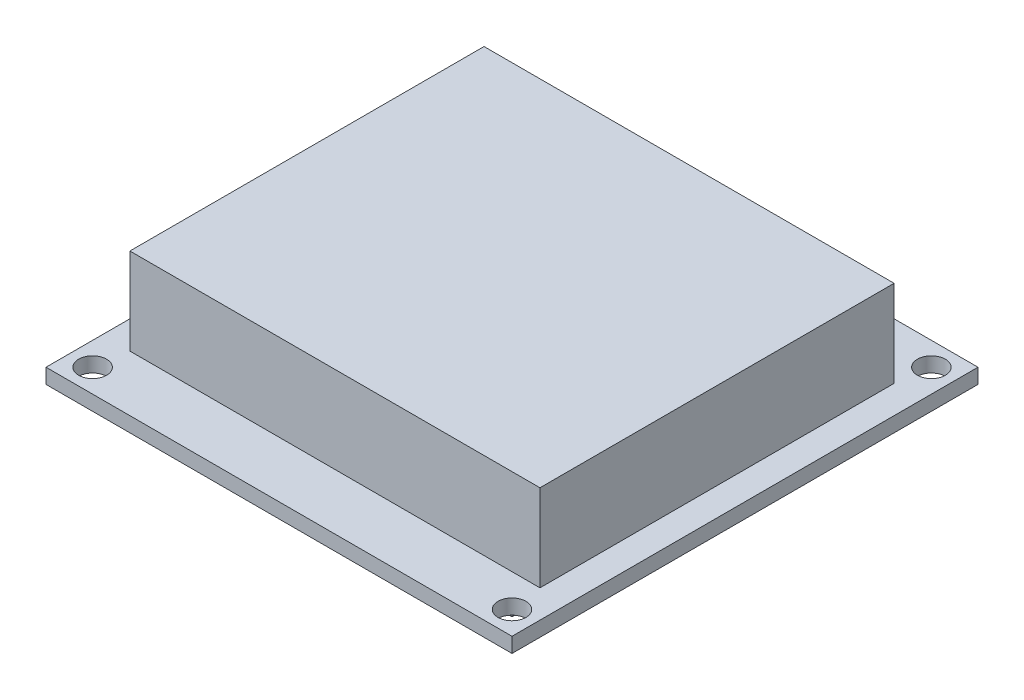
ISO-10303-21;
HEADER;
FILE_DESCRIPTION(('STEP AP214'),'2;1');
FILE_NAME('part.step','',(''),(''),'','','');
FILE_SCHEMA(('AUTOMOTIVE_DESIGN { 1 0 10303 214 1 1 1 1 }'));
ENDSEC;
DATA;
#1=APPLICATION_CONTEXT('core data for automotive mechanical design processes');
#2=APPLICATION_PROTOCOL_DEFINITION('international standard','automotive_design',2000,#1);
#3=PRODUCT_CONTEXT('',#1,'mechanical');
#4=PRODUCT('Part','Part','',(#3));
#5=PRODUCT_RELATED_PRODUCT_CATEGORY('part','',(#4));
#6=PRODUCT_DEFINITION_FORMATION('','',#4);
#7=PRODUCT_DEFINITION_CONTEXT('part definition',#1,'design');
#8=PRODUCT_DEFINITION('design','',#6,#7);
#9=PRODUCT_DEFINITION_SHAPE('','',#8);
#10=(LENGTH_UNIT() NAMED_UNIT(*) SI_UNIT(.MILLI.,.METRE.));
#11=(NAMED_UNIT(*) PLANE_ANGLE_UNIT() SI_UNIT($,.RADIAN.));
#12=(NAMED_UNIT(*) SI_UNIT($,.STERADIAN.) SOLID_ANGLE_UNIT());
#13=UNCERTAINTY_MEASURE_WITH_UNIT(LENGTH_MEASURE(1.E-05),#10,'distance_accuracy_value','');
#14=(GEOMETRIC_REPRESENTATION_CONTEXT(3) GLOBAL_UNCERTAINTY_ASSIGNED_CONTEXT((#13)) GLOBAL_UNIT_ASSIGNED_CONTEXT((#10,
#11,#12)) REPRESENTATION_CONTEXT('',''));
#15=CARTESIAN_POINT('',(0.,0.,0.));
#16=DIRECTION('',(0.,0.,1.));
#17=DIRECTION('',(1.,0.,0.));
#18=AXIS2_PLACEMENT_3D('',#15,#16,#17);
#19=CARTESIAN_POINT('',(-25.,1.6,-25.));
#20=DIRECTION('',(1.,0.,0.));
#21=DIRECTION('',(0.,0.,-1.));
#22=AXIS2_PLACEMENT_3D('',#19,#20,#21);
#23=PLANE('',#22);
#24=DIRECTION('',(0.,0.,1.));
#25=VECTOR('',#24,1.);
#26=CARTESIAN_POINT('',(-25.,0.,-25.));
#27=LINE('',#26,#25);
#28=CARTESIAN_POINT('',(-25.,0.,-25.));
#29=VERTEX_POINT('',#28);
#30=CARTESIAN_POINT('',(-25.,0.,25.));
#31=VERTEX_POINT('',#30);
#32=EDGE_CURVE('E220',#29,#31,#27,.T.);
#33=ORIENTED_EDGE('',*,*,#32,.T.);
#34=DIRECTION('',(0.,-1.,0.));
#35=VECTOR('',#34,1.);
#36=CARTESIAN_POINT('',(-25.,1.6,25.));
#37=LINE('',#36,#35);
#38=CARTESIAN_POINT('',(-25.,1.6,25.));
#39=VERTEX_POINT('',#38);
#40=EDGE_CURVE('E11',#39,#31,#37,.T.);
#41=ORIENTED_EDGE('',*,*,#40,.F.);
#42=DIRECTION('',(0.,0.,1.));
#43=VECTOR('',#42,1.);
#44=CARTESIAN_POINT('',(-25.,1.6,-25.));
#45=LINE('',#44,#43);
#46=CARTESIAN_POINT('',(-25.,1.6,-25.));
#47=VERTEX_POINT('',#46);
#48=EDGE_CURVE('E218',#47,#39,#45,.T.);
#49=ORIENTED_EDGE('',*,*,#48,.F.);
#50=DIRECTION('',(0.,-1.,0.));
#51=VECTOR('',#50,1.);
#52=CARTESIAN_POINT('',(-25.,1.6,-25.));
#53=LINE('',#52,#51);
#54=EDGE_CURVE('E229',#47,#29,#53,.T.);
#55=ORIENTED_EDGE('',*,*,#54,.T.);
#56=EDGE_LOOP('',(#33,#41,#49,#55));
#57=FACE_BOUND('',#56,.T.);
#58=ADVANCED_FACE('F39',(#57),#23,.F.);
#59=CARTESIAN_POINT('',(-25.,1.6,25.));
#60=DIRECTION('',(0.,0.,-1.));
#61=DIRECTION('',(-1.,0.,0.));
#62=AXIS2_PLACEMENT_3D('',#59,#60,#61);
#63=PLANE('',#62);
#64=DIRECTION('',(1.,0.,0.));
#65=VECTOR('',#64,1.);
#66=CARTESIAN_POINT('',(-25.,0.,25.));
#67=LINE('',#66,#65);
#68=CARTESIAN_POINT('',(25.,0.,25.));
#69=VERTEX_POINT('',#68);
#70=EDGE_CURVE('E231',#31,#69,#67,.T.);
#71=ORIENTED_EDGE('',*,*,#70,.T.);
#72=DIRECTION('',(0.,-1.,0.));
#73=VECTOR('',#72,1.);
#74=CARTESIAN_POINT('',(25.,1.6,25.));
#75=LINE('',#74,#73);
#76=CARTESIAN_POINT('',(25.,1.6,25.));
#77=VERTEX_POINT('',#76);
#78=EDGE_CURVE('E46',#77,#69,#75,.T.);
#79=ORIENTED_EDGE('',*,*,#78,.F.);
#80=DIRECTION('',(1.,0.,0.));
#81=VECTOR('',#80,1.);
#82=CARTESIAN_POINT('',(-25.,1.6,25.));
#83=LINE('',#82,#81);
#84=EDGE_CURVE('E222',#39,#77,#83,.T.);
#85=ORIENTED_EDGE('',*,*,#84,.F.);
#86=ORIENTED_EDGE('',*,*,#40,.T.);
#87=EDGE_LOOP('',(#71,#79,#85,#86));
#88=FACE_BOUND('',#87,.T.);
#89=ADVANCED_FACE('F264',(#88),#63,.F.);
#90=CARTESIAN_POINT('',(25.,1.6,-25.));
#91=DIRECTION('',(-1.,0.,0.));
#92=DIRECTION('',(0.,0.,1.));
#93=AXIS2_PLACEMENT_3D('',#90,#91,#92);
#94=PLANE('',#93);
#95=DIRECTION('',(0.,0.,-1.));
#96=VECTOR('',#95,1.);
#97=CARTESIAN_POINT('',(25.,0.,-25.));
#98=LINE('',#97,#96);
#99=CARTESIAN_POINT('',(25.,0.,-25.));
#100=VERTEX_POINT('',#99);
#101=EDGE_CURVE('E232',#69,#100,#98,.T.);
#102=ORIENTED_EDGE('',*,*,#101,.T.);
#103=DIRECTION('',(0.,-1.,0.));
#104=VECTOR('',#103,1.);
#105=CARTESIAN_POINT('',(25.,1.6,-25.));
#106=LINE('',#105,#104);
#107=CARTESIAN_POINT('',(25.,1.6,-25.));
#108=VERTEX_POINT('',#107);
#109=EDGE_CURVE('E239',#108,#100,#106,.T.);
#110=ORIENTED_EDGE('',*,*,#109,.F.);
#111=DIRECTION('',(0.,0.,-1.));
#112=VECTOR('',#111,1.);
#113=CARTESIAN_POINT('',(25.,1.6,-25.));
#114=LINE('',#113,#112);
#115=EDGE_CURVE('E228',#77,#108,#114,.T.);
#116=ORIENTED_EDGE('',*,*,#115,.F.);
#117=ORIENTED_EDGE('',*,*,#78,.T.);
#118=EDGE_LOOP('',(#102,#110,#116,#117));
#119=FACE_BOUND('',#118,.T.);
#120=ADVANCED_FACE('F250',(#119),#94,.F.);
#121=CARTESIAN_POINT('',(-25.,1.6,-25.));
#122=DIRECTION('',(0.,0.,1.));
#123=DIRECTION('',(1.,0.,0.));
#124=AXIS2_PLACEMENT_3D('',#121,#122,#123);
#125=PLANE('',#124);
#126=DIRECTION('',(-1.,0.,0.));
#127=VECTOR('',#126,1.);
#128=CARTESIAN_POINT('',(-25.,0.,-25.));
#129=LINE('',#128,#127);
#130=EDGE_CURVE('E223',#100,#29,#129,.T.);
#131=ORIENTED_EDGE('',*,*,#130,.T.);
#132=ORIENTED_EDGE('',*,*,#54,.F.);
#133=DIRECTION('',(-1.,0.,0.));
#134=VECTOR('',#133,1.);
#135=CARTESIAN_POINT('',(-25.,1.6,-25.));
#136=LINE('',#135,#134);
#137=EDGE_CURVE('E226',#108,#47,#136,.T.);
#138=ORIENTED_EDGE('',*,*,#137,.F.);
#139=ORIENTED_EDGE('',*,*,#109,.T.);
#140=EDGE_LOOP('',(#131,#132,#138,#139));
#141=FACE_BOUND('',#140,.T.);
#142=ADVANCED_FACE('F257',(#141),#125,.F.);
#143=CARTESIAN_POINT('',(0.,1.6,0.));
#144=DIRECTION('',(0.,1.,0.));
#145=DIRECTION('',(0.,0.,1.));
#146=AXIS2_PLACEMENT_3D('',#143,#144,#145);
#147=PLANE('',#146);
#148=DIRECTION('',(0.,0.,1.));
#149=VECTOR('',#148,1.);
#150=CARTESIAN_POINT('',(-22.,1.6,-19.));
#151=LINE('',#150,#149);
#152=CARTESIAN_POINT('',(-22.,1.6,-19.));
#153=VERTEX_POINT('',#152);
#154=CARTESIAN_POINT('',(-22.,1.6,19.));
#155=VERTEX_POINT('',#154);
#156=EDGE_CURVE('E62',#153,#155,#151,.T.);
#157=ORIENTED_EDGE('',*,*,#156,.F.);
#158=DIRECTION('',(-1.,0.,0.));
#159=VECTOR('',#158,1.);
#160=CARTESIAN_POINT('',(-22.,1.6,-19.));
#161=LINE('',#160,#159);
#162=CARTESIAN_POINT('',(22.,1.6,-19.));
#163=VERTEX_POINT('',#162);
#164=EDGE_CURVE('E169',#163,#153,#161,.T.);
#165=ORIENTED_EDGE('',*,*,#164,.F.);
#166=DIRECTION('',(0.,0.,-1.));
#167=VECTOR('',#166,1.);
#168=CARTESIAN_POINT('',(22.,1.6,-19.));
#169=LINE('',#168,#167);
#170=CARTESIAN_POINT('',(22.,1.6,19.));
#171=VERTEX_POINT('',#170);
#172=EDGE_CURVE('E179',#171,#163,#169,.T.);
#173=ORIENTED_EDGE('',*,*,#172,.F.);
#174=DIRECTION('',(1.,0.,0.));
#175=VECTOR('',#174,1.);
#176=CARTESIAN_POINT('',(-22.,1.6,19.));
#177=LINE('',#176,#175);
#178=EDGE_CURVE('E180',#155,#171,#177,.T.);
#179=ORIENTED_EDGE('',*,*,#178,.F.);
#180=EDGE_LOOP('',(#157,#165,#173,#179));
#181=FACE_BOUND('',#180,.T.);
#182=CARTESIAN_POINT('',(-22.5,1.6,22.5));
#183=DIRECTION('',(0.,1.,0.));
#184=DIRECTION('',(0.,0.,1.));
#185=AXIS2_PLACEMENT_3D('',#182,#183,#184);
#186=CIRCLE('',#185,1.5);
#187=CARTESIAN_POINT('',(-22.5,1.6,24.));
#188=VERTEX_POINT('',#187);
#189=EDGE_CURVE('E207',#188,#188,#186,.T.);
#190=ORIENTED_EDGE('',*,*,#189,.F.);
#191=EDGE_LOOP('',(#190));
#192=FACE_BOUND('',#191,.T.);
#193=CARTESIAN_POINT('',(22.5,1.6,-22.5));
#194=DIRECTION('',(0.,1.,0.));
#195=DIRECTION('',(0.,0.,1.));
#196=AXIS2_PLACEMENT_3D('',#193,#194,#195);
#197=CIRCLE('',#196,1.5);
#198=CARTESIAN_POINT('',(22.5,1.6,-21.));
#199=VERTEX_POINT('',#198);
#200=EDGE_CURVE('E196',#199,#199,#197,.T.);
#201=ORIENTED_EDGE('',*,*,#200,.F.);
#202=EDGE_LOOP('',(#201));
#203=FACE_BOUND('',#202,.T.);
#204=CARTESIAN_POINT('',(-22.5,1.6,-22.5));
#205=DIRECTION('',(0.,1.,0.));
#206=DIRECTION('',(0.,0.,1.));
#207=AXIS2_PLACEMENT_3D('',#204,#205,#206);
#208=CIRCLE('',#207,1.5);
#209=CARTESIAN_POINT('',(-22.5,1.6,-21.));
#210=VERTEX_POINT('',#209);
#211=EDGE_CURVE('E193',#210,#210,#208,.T.);
#212=ORIENTED_EDGE('',*,*,#211,.F.);
#213=EDGE_LOOP('',(#212));
#214=FACE_BOUND('',#213,.T.);
#215=CARTESIAN_POINT('',(22.5,1.6,22.5));
#216=DIRECTION('',(0.,1.,0.));
#217=DIRECTION('',(0.,0.,1.));
#218=AXIS2_PLACEMENT_3D('',#215,#216,#217);
#219=CIRCLE('',#218,1.5);
#220=CARTESIAN_POINT('',(22.5,1.6,24.));
#221=VERTEX_POINT('',#220);
#222=EDGE_CURVE('E211',#221,#221,#219,.T.);
#223=ORIENTED_EDGE('',*,*,#222,.F.);
#224=EDGE_LOOP('',(#223));
#225=FACE_BOUND('',#224,.T.);
#226=ORIENTED_EDGE('',*,*,#48,.T.);
#227=ORIENTED_EDGE('',*,*,#84,.T.);
#228=ORIENTED_EDGE('',*,*,#115,.T.);
#229=ORIENTED_EDGE('',*,*,#137,.T.);
#230=EDGE_LOOP('',(#226,#227,#228,#229));
#231=FACE_BOUND('',#230,.T.);
#232=ADVANCED_FACE('F265',(#181,#192,#203,#214,#225,#231),#147,.T.);
#233=CARTESIAN_POINT('',(0.,0.,0.));
#234=DIRECTION('',(0.,1.,0.));
#235=DIRECTION('',(0.,0.,1.));
#236=AXIS2_PLACEMENT_3D('',#233,#234,#235);
#237=PLANE('',#236);
#238=DIRECTION('',(-1.,0.,0.));
#239=VECTOR('',#238,1.);
#240=CARTESIAN_POINT('',(-20.,0.,-20.));
#241=LINE('',#240,#239);
#242=CARTESIAN_POINT('',(20.,0.,-20.));
#243=VERTEX_POINT('',#242);
#244=CARTESIAN_POINT('',(-20.,0.,-20.));
#245=VERTEX_POINT('',#244);
#246=EDGE_CURVE('E146',#243,#245,#241,.T.);
#247=ORIENTED_EDGE('',*,*,#246,.T.);
#248=DIRECTION('',(0.,0.,1.));
#249=VECTOR('',#248,1.);
#250=CARTESIAN_POINT('',(-20.,0.,-20.));
#251=LINE('',#250,#249);
#252=CARTESIAN_POINT('',(-20.,0.,20.));
#253=VERTEX_POINT('',#252);
#254=EDGE_CURVE('E52',#245,#253,#251,.T.);
#255=ORIENTED_EDGE('',*,*,#254,.T.);
#256=DIRECTION('',(1.,0.,0.));
#257=VECTOR('',#256,1.);
#258=CARTESIAN_POINT('',(-20.,0.,20.));
#259=LINE('',#258,#257);
#260=CARTESIAN_POINT('',(20.,0.,20.));
#261=VERTEX_POINT('',#260);
#262=EDGE_CURVE('E135',#253,#261,#259,.T.);
#263=ORIENTED_EDGE('',*,*,#262,.T.);
#264=DIRECTION('',(0.,0.,-1.));
#265=VECTOR('',#264,1.);
#266=CARTESIAN_POINT('',(20.,0.,-20.));
#267=LINE('',#266,#265);
#268=EDGE_CURVE('E155',#261,#243,#267,.T.);
#269=ORIENTED_EDGE('',*,*,#268,.T.);
#270=EDGE_LOOP('',(#247,#255,#263,#269));
#271=FACE_BOUND('',#270,.T.);
#272=CARTESIAN_POINT('',(-22.5,0.,22.5));
#273=DIRECTION('',(0.,1.,0.));
#274=DIRECTION('',(0.,0.,1.));
#275=AXIS2_PLACEMENT_3D('',#272,#273,#274);
#276=CIRCLE('',#275,1.5);
#277=CARTESIAN_POINT('',(-22.5,0.,24.));
#278=VERTEX_POINT('',#277);
#279=EDGE_CURVE('E205',#278,#278,#276,.T.);
#280=ORIENTED_EDGE('',*,*,#279,.T.);
#281=EDGE_LOOP('',(#280));
#282=FACE_BOUND('',#281,.T.);
#283=CARTESIAN_POINT('',(22.5,0.,-22.5));
#284=DIRECTION('',(0.,1.,0.));
#285=DIRECTION('',(0.,0.,1.));
#286=AXIS2_PLACEMENT_3D('',#283,#284,#285);
#287=CIRCLE('',#286,1.5);
#288=CARTESIAN_POINT('',(22.5,0.,-21.));
#289=VERTEX_POINT('',#288);
#290=EDGE_CURVE('E209',#289,#289,#287,.T.);
#291=ORIENTED_EDGE('',*,*,#290,.T.);
#292=EDGE_LOOP('',(#291));
#293=FACE_BOUND('',#292,.T.);
#294=CARTESIAN_POINT('',(-22.5,0.,-22.5));
#295=DIRECTION('',(0.,1.,0.));
#296=DIRECTION('',(0.,0.,1.));
#297=AXIS2_PLACEMENT_3D('',#294,#295,#296);
#298=CIRCLE('',#297,1.5);
#299=CARTESIAN_POINT('',(-22.5,0.,-21.));
#300=VERTEX_POINT('',#299);
#301=EDGE_CURVE('E197',#300,#300,#298,.T.);
#302=ORIENTED_EDGE('',*,*,#301,.T.);
#303=EDGE_LOOP('',(#302));
#304=FACE_BOUND('',#303,.T.);
#305=CARTESIAN_POINT('',(22.5,0.,22.5));
#306=DIRECTION('',(0.,1.,0.));
#307=DIRECTION('',(0.,0.,1.));
#308=AXIS2_PLACEMENT_3D('',#305,#306,#307);
#309=CIRCLE('',#308,1.5);
#310=CARTESIAN_POINT('',(22.5,0.,24.));
#311=VERTEX_POINT('',#310);
#312=EDGE_CURVE('E204',#311,#311,#309,.T.);
#313=ORIENTED_EDGE('',*,*,#312,.T.);
#314=EDGE_LOOP('',(#313));
#315=FACE_BOUND('',#314,.T.);
#316=ORIENTED_EDGE('',*,*,#32,.F.);
#317=ORIENTED_EDGE('',*,*,#130,.F.);
#318=ORIENTED_EDGE('',*,*,#101,.F.);
#319=ORIENTED_EDGE('',*,*,#70,.F.);
#320=EDGE_LOOP('',(#316,#317,#318,#319));
#321=FACE_BOUND('',#320,.T.);
#322=ADVANCED_FACE('F254',(#271,#282,#293,#304,#315,#321),#237,.F.);
#323=CARTESIAN_POINT('',(22.5,1.6,22.5));
#324=DIRECTION('',(0.,-1.,0.));
#325=DIRECTION('',(0.,0.,-1.));
#326=AXIS2_PLACEMENT_3D('',#323,#324,#325);
#327=CYLINDRICAL_SURFACE('',#326,1.5);
#328=ORIENTED_EDGE('',*,*,#222,.T.);
#329=EDGE_LOOP('',(#328));
#330=FACE_BOUND('',#329,.T.);
#331=ORIENTED_EDGE('',*,*,#312,.F.);
#332=EDGE_LOOP('',(#331));
#333=FACE_BOUND('',#332,.T.);
#334=ADVANCED_FACE('F273',(#330,#333),#327,.F.);
#335=CARTESIAN_POINT('',(-22.5,1.6,-22.5));
#336=DIRECTION('',(0.,-1.,0.));
#337=DIRECTION('',(0.,0.,-1.));
#338=AXIS2_PLACEMENT_3D('',#335,#336,#337);
#339=CYLINDRICAL_SURFACE('',#338,1.5);
#340=ORIENTED_EDGE('',*,*,#211,.T.);
#341=EDGE_LOOP('',(#340));
#342=FACE_BOUND('',#341,.T.);
#343=ORIENTED_EDGE('',*,*,#301,.F.);
#344=EDGE_LOOP('',(#343));
#345=FACE_BOUND('',#344,.T.);
#346=ADVANCED_FACE('F282',(#342,#345),#339,.F.);
#347=CARTESIAN_POINT('',(22.5,1.6,-22.5));
#348=DIRECTION('',(0.,-1.,0.));
#349=DIRECTION('',(0.,0.,-1.));
#350=AXIS2_PLACEMENT_3D('',#347,#348,#349);
#351=CYLINDRICAL_SURFACE('',#350,1.5);
#352=ORIENTED_EDGE('',*,*,#200,.T.);
#353=EDGE_LOOP('',(#352));
#354=FACE_BOUND('',#353,.T.);
#355=ORIENTED_EDGE('',*,*,#290,.F.);
#356=EDGE_LOOP('',(#355));
#357=FACE_BOUND('',#356,.T.);
#358=ADVANCED_FACE('F284',(#354,#357),#351,.F.);
#359=CARTESIAN_POINT('',(-22.5,1.6,22.5));
#360=DIRECTION('',(0.,-1.,0.));
#361=DIRECTION('',(0.,0.,-1.));
#362=AXIS2_PLACEMENT_3D('',#359,#360,#361);
#363=CYLINDRICAL_SURFACE('',#362,1.5);
#364=ORIENTED_EDGE('',*,*,#189,.T.);
#365=EDGE_LOOP('',(#364));
#366=FACE_BOUND('',#365,.T.);
#367=ORIENTED_EDGE('',*,*,#279,.F.);
#368=EDGE_LOOP('',(#367));
#369=FACE_BOUND('',#368,.T.);
#370=ADVANCED_FACE('F286',(#366,#369),#363,.F.);
#371=CARTESIAN_POINT('',(-22.,10.9,-19.));
#372=DIRECTION('',(1.,0.,0.));
#373=DIRECTION('',(0.,0.,-1.));
#374=AXIS2_PLACEMENT_3D('',#371,#372,#373);
#375=PLANE('',#374);
#376=ORIENTED_EDGE('',*,*,#156,.T.);
#377=DIRECTION('',(0.,-1.,0.));
#378=VECTOR('',#377,1.);
#379=CARTESIAN_POINT('',(-22.,10.9,19.));
#380=LINE('',#379,#378);
#381=CARTESIAN_POINT('',(-22.,10.9,19.));
#382=VERTEX_POINT('',#381);
#383=EDGE_CURVE('E195',#382,#155,#380,.T.);
#384=ORIENTED_EDGE('',*,*,#383,.F.);
#385=DIRECTION('',(0.,0.,1.));
#386=VECTOR('',#385,1.);
#387=CARTESIAN_POINT('',(-22.,10.9,-19.));
#388=LINE('',#387,#386);
#389=CARTESIAN_POINT('',(-22.,10.9,-19.));
#390=VERTEX_POINT('',#389);
#391=EDGE_CURVE('E164',#390,#382,#388,.T.);
#392=ORIENTED_EDGE('',*,*,#391,.F.);
#393=DIRECTION('',(0.,-1.,0.));
#394=VECTOR('',#393,1.);
#395=CARTESIAN_POINT('',(-22.,10.9,-19.));
#396=LINE('',#395,#394);
#397=EDGE_CURVE('E174',#390,#153,#396,.T.);
#398=ORIENTED_EDGE('',*,*,#397,.T.);
#399=EDGE_LOOP('',(#376,#384,#392,#398));
#400=FACE_BOUND('',#399,.T.);
#401=ADVANCED_FACE('F289',(#400),#375,.F.);
#402=CARTESIAN_POINT('',(-22.,10.9,19.));
#403=DIRECTION('',(0.,0.,-1.));
#404=DIRECTION('',(-1.,0.,0.));
#405=AXIS2_PLACEMENT_3D('',#402,#403,#404);
#406=PLANE('',#405);
#407=ORIENTED_EDGE('',*,*,#178,.T.);
#408=DIRECTION('',(0.,-1.,0.));
#409=VECTOR('',#408,1.);
#410=CARTESIAN_POINT('',(22.,10.9,19.));
#411=LINE('',#410,#409);
#412=CARTESIAN_POINT('',(22.,10.9,19.));
#413=VERTEX_POINT('',#412);
#414=EDGE_CURVE('E186',#413,#171,#411,.T.);
#415=ORIENTED_EDGE('',*,*,#414,.F.);
#416=DIRECTION('',(1.,0.,0.));
#417=VECTOR('',#416,1.);
#418=CARTESIAN_POINT('',(-22.,10.9,19.));
#419=LINE('',#418,#417);
#420=EDGE_CURVE('E166',#382,#413,#419,.T.);
#421=ORIENTED_EDGE('',*,*,#420,.F.);
#422=ORIENTED_EDGE('',*,*,#383,.T.);
#423=EDGE_LOOP('',(#407,#415,#421,#422));
#424=FACE_BOUND('',#423,.T.);
#425=ADVANCED_FACE('F300',(#424),#406,.F.);
#426=CARTESIAN_POINT('',(22.,10.9,-19.));
#427=DIRECTION('',(-1.,0.,0.));
#428=DIRECTION('',(0.,0.,1.));
#429=AXIS2_PLACEMENT_3D('',#426,#427,#428);
#430=PLANE('',#429);
#431=ORIENTED_EDGE('',*,*,#172,.T.);
#432=DIRECTION('',(0.,-1.,0.));
#433=VECTOR('',#432,1.);
#434=CARTESIAN_POINT('',(22.,10.9,-19.));
#435=LINE('',#434,#433);
#436=CARTESIAN_POINT('',(22.,10.9,-19.));
#437=VERTEX_POINT('',#436);
#438=EDGE_CURVE('E187',#437,#163,#435,.T.);
#439=ORIENTED_EDGE('',*,*,#438,.F.);
#440=DIRECTION('',(0.,0.,-1.));
#441=VECTOR('',#440,1.);
#442=CARTESIAN_POINT('',(22.,10.9,-19.));
#443=LINE('',#442,#441);
#444=EDGE_CURVE('E171',#413,#437,#443,.T.);
#445=ORIENTED_EDGE('',*,*,#444,.F.);
#446=ORIENTED_EDGE('',*,*,#414,.T.);
#447=EDGE_LOOP('',(#431,#439,#445,#446));
#448=FACE_BOUND('',#447,.T.);
#449=ADVANCED_FACE('F301',(#448),#430,.F.);
#450=CARTESIAN_POINT('',(-22.,10.9,-19.));
#451=DIRECTION('',(0.,0.,1.));
#452=DIRECTION('',(1.,0.,0.));
#453=AXIS2_PLACEMENT_3D('',#450,#451,#452);
#454=PLANE('',#453);
#455=ORIENTED_EDGE('',*,*,#164,.T.);
#456=ORIENTED_EDGE('',*,*,#397,.F.);
#457=DIRECTION('',(-1.,0.,0.));
#458=VECTOR('',#457,1.);
#459=CARTESIAN_POINT('',(-22.,10.9,-19.));
#460=LINE('',#459,#458);
#461=EDGE_CURVE('E173',#437,#390,#460,.T.);
#462=ORIENTED_EDGE('',*,*,#461,.F.);
#463=ORIENTED_EDGE('',*,*,#438,.T.);
#464=EDGE_LOOP('',(#455,#456,#462,#463));
#465=FACE_BOUND('',#464,.T.);
#466=ADVANCED_FACE('F304',(#465),#454,.F.);
#467=CARTESIAN_POINT('',(0.,10.9,0.));
#468=DIRECTION('',(0.,1.,0.));
#469=DIRECTION('',(0.,0.,1.));
#470=AXIS2_PLACEMENT_3D('',#467,#468,#469);
#471=PLANE('',#470);
#472=ORIENTED_EDGE('',*,*,#391,.T.);
#473=ORIENTED_EDGE('',*,*,#420,.T.);
#474=ORIENTED_EDGE('',*,*,#444,.T.);
#475=ORIENTED_EDGE('',*,*,#461,.T.);
#476=EDGE_LOOP('',(#472,#473,#474,#475));
#477=FACE_BOUND('',#476,.T.);
#478=ADVANCED_FACE('F307',(#477),#471,.T.);
#479=CARTESIAN_POINT('',(-20.,-1.6,-20.));
#480=DIRECTION('',(-1.,0.,0.));
#481=DIRECTION('',(0.,0.,1.));
#482=AXIS2_PLACEMENT_3D('',#479,#480,#481);
#483=PLANE('',#482);
#484=ORIENTED_EDGE('',*,*,#254,.F.);
#485=DIRECTION('',(0.,1.,0.));
#486=VECTOR('',#485,1.);
#487=CARTESIAN_POINT('',(-20.,-1.6,-20.));
#488=LINE('',#487,#486);
#489=CARTESIAN_POINT('',(-20.,-1.6,-20.));
#490=VERTEX_POINT('',#489);
#491=EDGE_CURVE('E149',#490,#245,#488,.T.);
#492=ORIENTED_EDGE('',*,*,#491,.F.);
#493=DIRECTION('',(0.,0.,1.));
#494=VECTOR('',#493,1.);
#495=CARTESIAN_POINT('',(-20.,-1.6,-20.));
#496=LINE('',#495,#494);
#497=CARTESIAN_POINT('',(-20.,-1.6,20.));
#498=VERTEX_POINT('',#497);
#499=EDGE_CURVE('E145',#490,#498,#496,.T.);
#500=ORIENTED_EDGE('',*,*,#499,.T.);
#501=DIRECTION('',(0.,1.,0.));
#502=VECTOR('',#501,1.);
#503=CARTESIAN_POINT('',(-20.,-1.6,20.));
#504=LINE('',#503,#502);
#505=EDGE_CURVE('E130',#498,#253,#504,.T.);
#506=ORIENTED_EDGE('',*,*,#505,.T.);
#507=EDGE_LOOP('',(#484,#492,#500,#506));
#508=FACE_BOUND('',#507,.T.);
#509=ADVANCED_FACE('F150',(#508),#483,.T.);
#510=CARTESIAN_POINT('',(-20.,-1.6,-20.));
#511=DIRECTION('',(0.,0.,-1.));
#512=DIRECTION('',(-1.,0.,0.));
#513=AXIS2_PLACEMENT_3D('',#510,#511,#512);
#514=PLANE('',#513);
#515=ORIENTED_EDGE('',*,*,#246,.F.);
#516=DIRECTION('',(0.,1.,0.));
#517=VECTOR('',#516,1.);
#518=CARTESIAN_POINT('',(20.,-1.6,-20.));
#519=LINE('',#518,#517);
#520=CARTESIAN_POINT('',(20.,-1.6,-20.));
#521=VERTEX_POINT('',#520);
#522=EDGE_CURVE('E162',#521,#243,#519,.T.);
#523=ORIENTED_EDGE('',*,*,#522,.F.);
#524=DIRECTION('',(-1.,0.,0.));
#525=VECTOR('',#524,1.);
#526=CARTESIAN_POINT('',(-20.,-1.6,-20.));
#527=LINE('',#526,#525);
#528=EDGE_CURVE('E133',#521,#490,#527,.T.);
#529=ORIENTED_EDGE('',*,*,#528,.T.);
#530=ORIENTED_EDGE('',*,*,#491,.T.);
#531=EDGE_LOOP('',(#515,#523,#529,#530));
#532=FACE_BOUND('',#531,.T.);
#533=ADVANCED_FACE('F317',(#532),#514,.T.);
#534=CARTESIAN_POINT('',(20.,-1.6,-20.));
#535=DIRECTION('',(1.,0.,0.));
#536=DIRECTION('',(0.,0.,-1.));
#537=AXIS2_PLACEMENT_3D('',#534,#535,#536);
#538=PLANE('',#537);
#539=ORIENTED_EDGE('',*,*,#268,.F.);
#540=DIRECTION('',(0.,1.,0.));
#541=VECTOR('',#540,1.);
#542=CARTESIAN_POINT('',(20.,-1.6,20.));
#543=LINE('',#542,#541);
#544=CARTESIAN_POINT('',(20.,-1.6,20.));
#545=VERTEX_POINT('',#544);
#546=EDGE_CURVE('E131',#545,#261,#543,.T.);
#547=ORIENTED_EDGE('',*,*,#546,.F.);
#548=DIRECTION('',(0.,0.,-1.));
#549=VECTOR('',#548,1.);
#550=CARTESIAN_POINT('',(20.,-1.6,-20.));
#551=LINE('',#550,#549);
#552=EDGE_CURVE('E143',#545,#521,#551,.T.);
#553=ORIENTED_EDGE('',*,*,#552,.T.);
#554=ORIENTED_EDGE('',*,*,#522,.T.);
#555=EDGE_LOOP('',(#539,#547,#553,#554));
#556=FACE_BOUND('',#555,.T.);
#557=ADVANCED_FACE('F316',(#556),#538,.T.);
#558=CARTESIAN_POINT('',(-20.,-1.6,20.));
#559=DIRECTION('',(0.,0.,1.));
#560=DIRECTION('',(1.,0.,0.));
#561=AXIS2_PLACEMENT_3D('',#558,#559,#560);
#562=PLANE('',#561);
#563=ORIENTED_EDGE('',*,*,#262,.F.);
#564=ORIENTED_EDGE('',*,*,#505,.F.);
#565=DIRECTION('',(1.,0.,0.));
#566=VECTOR('',#565,1.);
#567=CARTESIAN_POINT('',(-20.,-1.6,20.));
#568=LINE('',#567,#566);
#569=EDGE_CURVE('E128',#498,#545,#568,.T.);
#570=ORIENTED_EDGE('',*,*,#569,.T.);
#571=ORIENTED_EDGE('',*,*,#546,.T.);
#572=EDGE_LOOP('',(#563,#564,#570,#571));
#573=FACE_BOUND('',#572,.T.);
#574=ADVANCED_FACE('F126',(#573),#562,.T.);
#575=CARTESIAN_POINT('',(0.,-1.6,0.));
#576=DIRECTION('',(0.,1.,0.));
#577=DIRECTION('',(0.,0.,1.));
#578=AXIS2_PLACEMENT_3D('',#575,#576,#577);
#579=PLANE('',#578);
#580=ORIENTED_EDGE('',*,*,#499,.F.);
#581=ORIENTED_EDGE('',*,*,#528,.F.);
#582=ORIENTED_EDGE('',*,*,#552,.F.);
#583=ORIENTED_EDGE('',*,*,#569,.F.);
#584=EDGE_LOOP('',(#580,#581,#582,#583));
#585=FACE_BOUND('',#584,.T.);
#586=ADVANCED_FACE('F139',(#585),#579,.F.);
#587=CLOSED_SHELL('',(#58,#89,#120,#142,#232,#322,#334,#346,#358,#370,#401,#425,#449,#466,#478,
#509,#533,#557,#574,#586));
#588=MANIFOLD_SOLID_BREP('B2',#587);
#589=ADVANCED_BREP_SHAPE_REPRESENTATION('',(#18,#588),#14);
#590=SHAPE_DEFINITION_REPRESENTATION(#9,#589);
ENDSEC;
END-ISO-10303-21;
